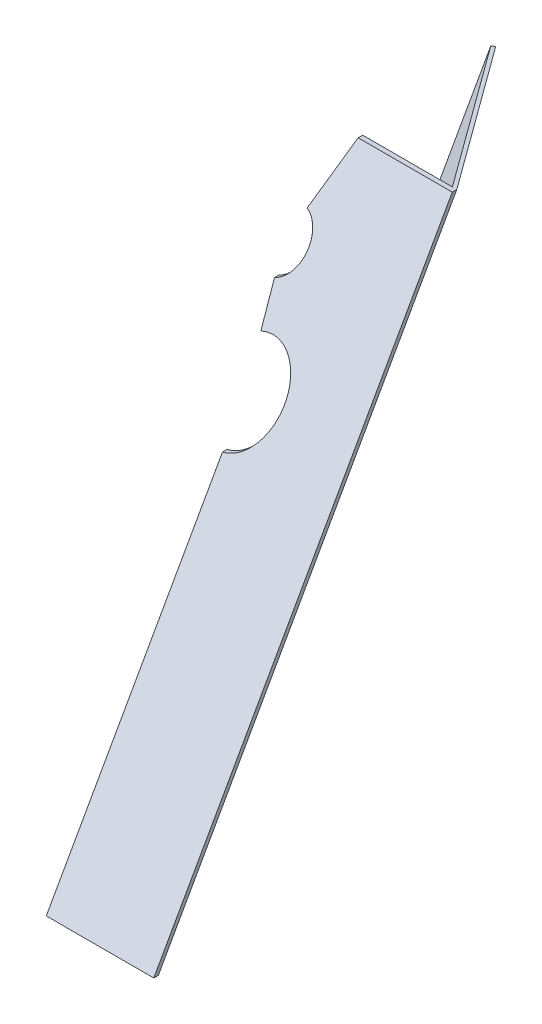
ISO-10303-21;
HEADER;
FILE_DESCRIPTION(('STEP AP214'),'2;1');
FILE_NAME('part.step','',(''),(''),'','','');
FILE_SCHEMA(('AUTOMOTIVE_DESIGN { 1 0 10303 214 1 1 1 1 }'));
ENDSEC;
DATA;
#1=APPLICATION_CONTEXT('core data for automotive mechanical design processes');
#2=APPLICATION_PROTOCOL_DEFINITION('international standard','automotive_design',2000,#1);
#3=PRODUCT_CONTEXT('',#1,'mechanical');
#4=PRODUCT('Part','Part','',(#3));
#5=PRODUCT_RELATED_PRODUCT_CATEGORY('part','',(#4));
#6=PRODUCT_DEFINITION_FORMATION('','',#4);
#7=PRODUCT_DEFINITION_CONTEXT('part definition',#1,'design');
#8=PRODUCT_DEFINITION('design','',#6,#7);
#9=PRODUCT_DEFINITION_SHAPE('','',#8);
#10=(LENGTH_UNIT() NAMED_UNIT(*) SI_UNIT(.MILLI.,.METRE.));
#11=(NAMED_UNIT(*) PLANE_ANGLE_UNIT() SI_UNIT($,.RADIAN.));
#12=(NAMED_UNIT(*) SI_UNIT($,.STERADIAN.) SOLID_ANGLE_UNIT());
#13=UNCERTAINTY_MEASURE_WITH_UNIT(LENGTH_MEASURE(1.E-05),#10,'distance_accuracy_value','');
#14=(GEOMETRIC_REPRESENTATION_CONTEXT(3) GLOBAL_UNCERTAINTY_ASSIGNED_CONTEXT((#13)) GLOBAL_UNIT_ASSIGNED_CONTEXT((#10,
#11,#12)) REPRESENTATION_CONTEXT('',''));
#15=CARTESIAN_POINT('',(0.,0.,0.));
#16=DIRECTION('',(0.,0.,1.));
#17=DIRECTION('',(1.,0.,0.));
#18=AXIS2_PLACEMENT_3D('',#15,#16,#17);
#19=CARTESIAN_POINT('',(0.,0.,0.));
#20=DIRECTION('',(0.,0.615661475325657,0.788010753606723));
#21=DIRECTION('',(0.,-0.788010753606723,0.615661475325657));
#22=AXIS2_PLACEMENT_3D('',#19,#20,#21);
#23=PLANE('',#22);
#24=DIRECTION('',(-0.209564715392473,-0.770512800762292,0.601990576275011));
#25=VECTOR('',#24,1.);
#26=CARTESIAN_POINT('',(-227.443511058113,38.4128157338381,-30.0113808064987));
#27=LINE('',#26,#25);
#28=CARTESIAN_POINT('',(-303.634542969345,-241.72100966204,188.853150473643));
#29=VERTEX_POINT('',#28);
#30=CARTESIAN_POINT('',(-312.982021819166,-276.089162216509,215.704494074039));
#31=VERTEX_POINT('',#30);
#32=EDGE_CURVE('E178',#29,#31,#27,.T.);
#33=ORIENTED_EDGE('',*,*,#32,.T.);
#34=CARTESIAN_POINT('',(-317.148366918662,-291.407686737882,227.672637101878));
#35=DIRECTION('',(0.,0.615661475325657,0.788010753606723));
#36=DIRECTION('',(0.,0.788010753606723,-0.615661475325657));
#37=AXIS2_PLACEMENT_3D('',#34,#35,#36);
#38=ELLIPSE('',#37,20.1456641642771,15.875);
#39=CARTESIAN_POINT('',(-312.26908061109,-306.514247899468,239.47517620337));
#40=VERTEX_POINT('',#39);
#41=EDGE_CURVE('E11',#31,#40,#38,.F.);
#42=ORIENTED_EDGE('',*,*,#41,.T.);
#43=DIRECTION('',(-0.246656603580926,0.763663542785337,-0.596639349465379));
#44=VECTOR('',#43,1.);
#45=CARTESIAN_POINT('',(-386.249002663396,-77.4680008124249,60.524635548958));
#46=LINE('',#45,#44);
#47=CARTESIAN_POINT('',(-305.438079780489,-327.663433525689,255.998730945459));
#48=VERTEX_POINT('',#47);
#49=EDGE_CURVE('E55',#48,#40,#46,.T.);
#50=ORIENTED_EDGE('',*,*,#49,.F.);
#51=CARTESIAN_POINT('',(-297.631221688374,-351.833931384226,274.882793507845));
#52=DIRECTION('',(0.,0.615661475325657,0.788010753606723));
#53=DIRECTION('',(0.,0.788010753606723,-0.615661475325657));
#54=AXIS2_PLACEMENT_3D('',#51,#52,#53);
#55=ELLIPSE('',#54,32.2330626628434,25.4);
#56=CARTESIAN_POINT('',(-294.096224923988,-376.986740330262,294.534321603653));
#57=VERTEX_POINT('',#56);
#58=EDGE_CURVE('E194',#48,#57,#55,.F.);
#59=ORIENTED_EDGE('',*,*,#58,.T.);
#60=DIRECTION('',(-0.110074710358999,0.783222261288649,-0.611920295104908));
#61=VECTOR('',#60,1.);
#62=CARTESIAN_POINT('',(-342.872902570837,-29.9226450433725,23.3781324794493));
#63=LINE('',#62,#61);
#64=CARTESIAN_POINT('',(-266.7,-571.92100966204,446.83366434616));
#65=VERTEX_POINT('',#64);
#66=EDGE_CURVE('E191',#65,#57,#63,.T.);
#67=ORIENTED_EDGE('',*,*,#66,.F.);
#68=DIRECTION('',(-1.,0.,0.));
#69=VECTOR('',#68,1.);
#70=CARTESIAN_POINT('',(0.,-571.92100966204,446.83366434616));
#71=LINE('',#70,#69);
#72=CARTESIAN_POINT('',(-190.5,-571.92100966204,446.83366434616));
#73=VERTEX_POINT('',#72);
#74=EDGE_CURVE('E188',#73,#65,#71,.T.);
#75=ORIENTED_EDGE('',*,*,#74,.F.);
#76=DIRECTION('',(0.110074710358999,-0.783222261288649,0.611920295104908));
#77=VECTOR('',#76,1.);
#78=CARTESIAN_POINT('',(-267.596175440616,-23.3532172202477,18.2455329468686));
#79=LINE('',#78,#77);
#80=CARTESIAN_POINT('',(-236.906583618729,-241.721009662041,188.853150473643));
#81=VERTEX_POINT('',#80);
#82=EDGE_CURVE('E185',#81,#73,#79,.T.);
#83=ORIENTED_EDGE('',*,*,#82,.F.);
#84=DIRECTION('',(1.,0.,0.));
#85=VECTOR('',#84,1.);
#86=CARTESIAN_POINT('',(-1.61917021465162E-13,-241.721009662041,188.853150473643));
#87=LINE('',#86,#85);
#88=EDGE_CURVE('E182',#29,#81,#87,.T.);
#89=ORIENTED_EDGE('',*,*,#88,.F.);
#90=EDGE_LOOP('',(#33,#42,#50,#59,#67,#75,#83,#89));
#91=FACE_BOUND('',#90,.T.);
#92=ADVANCED_FACE('F47',(#91),#23,.T.);
#93=CARTESIAN_POINT('',(-317.148366918662,-291.407686737882,781.890073663584));
#94=DIRECTION('',(0.,0.,-1.));
#95=DIRECTION('',(-1.,0.,0.));
#96=AXIS2_PLACEMENT_3D('',#93,#94,#95);
#97=CYLINDRICAL_SURFACE('',#96,15.875);
#98=DIRECTION('',(0.,0.,-1.));
#99=VECTOR('',#98,1.);
#100=CARTESIAN_POINT('',(-312.982021819166,-276.089162216509,781.890073663584));
#101=LINE('',#100,#99);
#102=CARTESIAN_POINT('',(-312.982021819166,-276.089162216508,212.481187807754));
#103=VERTEX_POINT('',#102);
#104=EDGE_CURVE('E217',#31,#103,#101,.T.);
#105=ORIENTED_EDGE('',*,*,#104,.T.);
#106=CARTESIAN_POINT('',(-317.148366918662,-291.407686737882,224.449330835594));
#107=DIRECTION('',(0.,0.615661475325657,0.788010753606723));
#108=DIRECTION('',(0.,0.788010753606723,-0.615661475325657));
#109=AXIS2_PLACEMENT_3D('',#106,#107,#108);
#110=ELLIPSE('',#109,20.1456641642771,15.875);
#111=CARTESIAN_POINT('',(-312.26908061109,-306.514247899468,236.251869937086));
#112=VERTEX_POINT('',#111);
#113=EDGE_CURVE('E175',#103,#112,#110,.F.);
#114=ORIENTED_EDGE('',*,*,#113,.T.);
#115=DIRECTION('',(0.,0.,-1.));
#116=VECTOR('',#115,1.);
#117=CARTESIAN_POINT('',(-312.26908061109,-306.514247899468,781.890073663584));
#118=LINE('',#117,#116);
#119=EDGE_CURVE('E160',#40,#112,#118,.T.);
#120=ORIENTED_EDGE('',*,*,#119,.F.);
#121=ORIENTED_EDGE('',*,*,#41,.F.);
#122=EDGE_LOOP('',(#105,#114,#120,#121));
#123=FACE_BOUND('',#122,.T.);
#124=ADVANCED_FACE('F210',(#123),#97,.F.);
#125=CARTESIAN_POINT('',(-372.418547742767,-120.28791339407,781.890073663584));
#126=DIRECTION('',(0.951594403879439,0.307356617799805,0.));
#127=DIRECTION('',(-0.307356617799805,0.951594403879439,0.));
#128=AXIS2_PLACEMENT_3D('',#125,#126,#127);
#129=PLANE('',#128);
#130=DIRECTION('',(-0.246656603580926,0.763663542785337,-0.596639349465379));
#131=VECTOR('',#130,1.);
#132=CARTESIAN_POINT('',(-385.774644682285,-78.9366413886135,58.4487570553544));
#133=LINE('',#132,#131);
#134=CARTESIAN_POINT('',(-305.438079780489,-327.663433525689,252.775424679174));
#135=VERTEX_POINT('',#134);
#136=EDGE_CURVE('E70',#135,#112,#133,.T.);
#137=ORIENTED_EDGE('',*,*,#136,.F.);
#138=DIRECTION('',(0.,0.,-1.));
#139=VECTOR('',#138,1.);
#140=CARTESIAN_POINT('',(-305.438079780489,-327.663433525689,781.890073663584));
#141=LINE('',#140,#139);
#142=EDGE_CURVE('E205',#48,#135,#141,.T.);
#143=ORIENTED_EDGE('',*,*,#142,.F.);
#144=ORIENTED_EDGE('',*,*,#49,.T.);
#145=ORIENTED_EDGE('',*,*,#119,.T.);
#146=EDGE_LOOP('',(#137,#143,#144,#145));
#147=FACE_BOUND('',#146,.T.);
#148=ADVANCED_FACE('F203',(#147),#129,.F.);
#149=CARTESIAN_POINT('',(-297.631221688374,-351.833931384226,781.890073663584));
#150=DIRECTION('',(0.,0.,-1.));
#151=DIRECTION('',(-1.,0.,0.));
#152=AXIS2_PLACEMENT_3D('',#149,#150,#151);
#153=CYLINDRICAL_SURFACE('',#152,25.4);
#154=ORIENTED_EDGE('',*,*,#142,.T.);
#155=CARTESIAN_POINT('',(-297.631221688374,-351.833931384226,271.659487241561));
#156=DIRECTION('',(0.,0.615661475325657,0.788010753606723));
#157=DIRECTION('',(0.,0.788010753606723,-0.615661475325657));
#158=AXIS2_PLACEMENT_3D('',#155,#156,#157);
#159=ELLIPSE('',#158,32.2330626628434,25.4);
#160=CARTESIAN_POINT('',(-294.096224923988,-376.986740330262,291.311015337369));
#161=VERTEX_POINT('',#160);
#162=EDGE_CURVE('E169',#135,#161,#159,.F.);
#163=ORIENTED_EDGE('',*,*,#162,.T.);
#164=DIRECTION('',(0.,0.,-1.));
#165=VECTOR('',#164,1.);
#166=CARTESIAN_POINT('',(-294.096224923988,-376.986740330262,781.890073663584));
#167=LINE('',#166,#165);
#168=EDGE_CURVE('E237',#57,#161,#167,.T.);
#169=ORIENTED_EDGE('',*,*,#168,.F.);
#170=ORIENTED_EDGE('',*,*,#58,.F.);
#171=EDGE_LOOP('',(#154,#163,#169,#170));
#172=FACE_BOUND('',#171,.T.);
#173=ADVANCED_FACE('F243',(#172),#153,.F.);
#174=CARTESIAN_POINT('',(-340.35564457309,-47.8338663839714,781.890073663584));
#175=DIRECTION('',(0.990268068741571,0.139173100960062,0.));
#176=DIRECTION('',(-0.139173100960062,0.990268068741571,0.));
#177=AXIS2_PLACEMENT_3D('',#174,#175,#176);
#178=PLANE('',#177);
#179=DIRECTION('',(-0.110074710358999,0.783222261288649,-0.611920295104908));
#180=VECTOR('',#179,1.);
#181=CARTESIAN_POINT('',(-342.655790494253,-31.4674777394618,21.3617817939772));
#182=LINE('',#181,#180);
#183=CARTESIAN_POINT('',(-266.7,-571.92100966204,443.610358079875));
#184=VERTEX_POINT('',#183);
#185=EDGE_CURVE('E166',#184,#161,#182,.T.);
#186=ORIENTED_EDGE('',*,*,#185,.F.);
#187=DIRECTION('',(0.,0.,-1.));
#188=VECTOR('',#187,1.);
#189=CARTESIAN_POINT('',(-266.7,-571.92100966204,781.890073663584));
#190=LINE('',#189,#188);
#191=EDGE_CURVE('E233',#65,#184,#190,.T.);
#192=ORIENTED_EDGE('',*,*,#191,.F.);
#193=ORIENTED_EDGE('',*,*,#66,.T.);
#194=ORIENTED_EDGE('',*,*,#168,.T.);
#195=EDGE_LOOP('',(#186,#192,#193,#194));
#196=FACE_BOUND('',#195,.T.);
#197=ADVANCED_FACE('F250',(#196),#178,.F.);
#198=CARTESIAN_POINT('',(0.,-571.92100966204,781.890073663584));
#199=DIRECTION('',(0.,1.,0.));
#200=DIRECTION('',(0.,0.,1.));
#201=AXIS2_PLACEMENT_3D('',#198,#199,#200);
#202=PLANE('',#201);
#203=DIRECTION('',(-1.,0.,0.));
#204=VECTOR('',#203,1.);
#205=CARTESIAN_POINT('',(0.,-571.92100966204,443.610358079875));
#206=LINE('',#205,#204);
#207=CARTESIAN_POINT('',(-193.642639476697,-571.92100966204,443.610358079875));
#208=VERTEX_POINT('',#207);
#209=EDGE_CURVE('E158',#208,#184,#206,.T.);
#210=ORIENTED_EDGE('',*,*,#209,.F.);
#211=DIRECTION('',(0.588856236540409,0.,0.808237794641816));
#212=VECTOR('',#211,1.);
#213=CARTESIAN_POINT('',(-266.575438200438,-571.92100966204,343.506052920688));
#214=LINE('',#213,#212);
#215=CARTESIAN_POINT('',(-266.575438200438,-571.92100966204,343.506052920688));
#216=VERTEX_POINT('',#215);
#217=EDGE_CURVE('E62',#216,#208,#214,.T.);
#218=ORIENTED_EDGE('',*,*,#217,.F.);
#219=DIRECTION('',(-0.808237794641821,0.,0.588856236540402));
#220=VECTOR('',#219,1.);
#221=CARTESIAN_POINT('',(-264.522514202048,-571.92100966204,342.010358079875));
#222=LINE('',#221,#220);
#223=CARTESIAN_POINT('',(-264.522514202048,-571.92100966204,342.010358079875));
#224=VERTEX_POINT('',#223);
#225=EDGE_CURVE('E268',#224,#216,#222,.T.);
#226=ORIENTED_EDGE('',*,*,#225,.F.);
#227=DIRECTION('',(-0.588856236540408,0.,-0.808237794641816));
#228=VECTOR('',#227,1.);
#229=CARTESIAN_POINT('',(-190.5,-571.92100966204,443.610358079875));
#230=LINE('',#229,#228);
#231=CARTESIAN_POINT('',(-190.5,-571.92100966204,443.610358079875));
#232=VERTEX_POINT('',#231);
#233=EDGE_CURVE('E147',#232,#224,#230,.T.);
#234=ORIENTED_EDGE('',*,*,#233,.F.);
#235=DIRECTION('',(0.,0.,-1.));
#236=VECTOR('',#235,1.);
#237=CARTESIAN_POINT('',(-190.5,-571.92100966204,781.890073663584));
#238=LINE('',#237,#236);
#239=EDGE_CURVE('E225',#73,#232,#238,.T.);
#240=ORIENTED_EDGE('',*,*,#239,.F.);
#241=ORIENTED_EDGE('',*,*,#74,.T.);
#242=ORIENTED_EDGE('',*,*,#191,.T.);
#243=EDGE_LOOP('',(#210,#218,#226,#234,#240,#241,#242));
#244=FACE_BOUND('',#243,.T.);
#245=ADVANCED_FACE('F252',(#244),#202,.F.);
#246=CARTESIAN_POINT('',(-265.63157395784,-37.332083127344,781.890073663584));
#247=DIRECTION('',(-0.990268068741571,-0.139173100960062,0.));
#248=DIRECTION('',(0.139173100960062,-0.990268068741571,0.));
#249=AXIS2_PLACEMENT_3D('',#246,#247,#248);
#250=PLANE('',#249);
#251=DIRECTION('',(0.110074710358999,-0.783222261288649,0.611920295104908));
#252=VECTOR('',#251,1.);
#253=CARTESIAN_POINT('',(-267.379063364032,-24.898049916337,16.2291822613965));
#254=LINE('',#253,#252);
#255=CARTESIAN_POINT('',(-236.906583618729,-241.72100966204,185.629844207358));
#256=VERTEX_POINT('',#255);
#257=EDGE_CURVE('E153',#256,#232,#254,.T.);
#258=ORIENTED_EDGE('',*,*,#257,.F.);
#259=DIRECTION('',(0.,0.,-1.));
#260=VECTOR('',#259,1.);
#261=CARTESIAN_POINT('',(-236.906583618729,-241.721009662041,781.890073663584));
#262=LINE('',#261,#260);
#263=EDGE_CURVE('E221',#81,#256,#262,.T.);
#264=ORIENTED_EDGE('',*,*,#263,.F.);
#265=ORIENTED_EDGE('',*,*,#82,.T.);
#266=ORIENTED_EDGE('',*,*,#239,.T.);
#267=EDGE_LOOP('',(#258,#264,#265,#266));
#268=FACE_BOUND('',#267,.T.);
#269=ADVANCED_FACE('F257',(#268),#250,.F.);
#270=CARTESIAN_POINT('',(-1.00544147113933E-13,-241.721009662041,781.890073663584));
#271=DIRECTION('',(0.,-1.,0.));
#272=DIRECTION('',(1.,0.,0.));
#273=AXIS2_PLACEMENT_3D('',#270,#271,#272);
#274=PLANE('',#273);
#275=DIRECTION('',(1.,0.,0.));
#276=VECTOR('',#275,1.);
#277=CARTESIAN_POINT('',(-1.6086952201927E-13,-241.721009662041,185.629844207359));
#278=LINE('',#277,#276);
#279=CARTESIAN_POINT('',(-303.634542969345,-241.72100966204,185.629844207358));
#280=VERTEX_POINT('',#279);
#281=CARTESIAN_POINT('',(-240.049223095426,-241.72100966204,185.629844207358));
#282=VERTEX_POINT('',#281);
#283=EDGE_CURVE('E136',#280,#282,#278,.T.);
#284=ORIENTED_EDGE('',*,*,#283,.F.);
#285=DIRECTION('',(0.,0.,-1.));
#286=VECTOR('',#285,1.);
#287=CARTESIAN_POINT('',(-303.634542969345,-241.72100966204,781.890073663584));
#288=LINE('',#287,#286);
#289=EDGE_CURVE('E216',#29,#280,#288,.T.);
#290=ORIENTED_EDGE('',*,*,#289,.F.);
#291=ORIENTED_EDGE('',*,*,#88,.T.);
#292=ORIENTED_EDGE('',*,*,#263,.T.);
#293=DIRECTION('',(-0.588856236540408,0.,-0.808237794641816));
#294=VECTOR('',#293,1.);
#295=CARTESIAN_POINT('',(-236.906583618729,-241.72100966204,185.629844207358));
#296=LINE('',#295,#294);
#297=CARTESIAN_POINT('',(-310.929097820776,-241.72100966204,84.0298442073585));
#298=VERTEX_POINT('',#297);
#299=EDGE_CURVE('E258',#256,#298,#296,.T.);
#300=ORIENTED_EDGE('',*,*,#299,.T.);
#301=DIRECTION('',(-0.808237794641821,0.,0.588856236540402));
#302=VECTOR('',#301,1.);
#303=CARTESIAN_POINT('',(-310.929097820776,-241.72100966204,84.0298442073585));
#304=LINE('',#303,#302);
#305=CARTESIAN_POINT('',(-312.982021819166,-241.72100966204,85.5255390481711));
#306=VERTEX_POINT('',#305);
#307=EDGE_CURVE('E139',#298,#306,#304,.T.);
#308=ORIENTED_EDGE('',*,*,#307,.T.);
#309=DIRECTION('',(0.588856236540409,0.,0.808237794641816));
#310=VECTOR('',#309,1.);
#311=CARTESIAN_POINT('',(-312.982021819166,-241.72100966204,85.5255390481711));
#312=LINE('',#311,#310);
#313=EDGE_CURVE('E132',#306,#282,#312,.T.);
#314=ORIENTED_EDGE('',*,*,#313,.T.);
#315=EDGE_LOOP('',(#284,#290,#291,#292,#300,#308,#314));
#316=FACE_BOUND('',#315,.T.);
#317=ADVANCED_FACE('F133',(#316),#274,.F.);
#318=CARTESIAN_POINT('',(-221.505506589186,60.2452527723146,781.890073663584));
#319=DIRECTION('',(-0.964946426543196,0.262446935401265,0.));
#320=DIRECTION('',(-0.262446935401265,-0.964946426543196,0.));
#321=AXIS2_PLACEMENT_3D('',#318,#319,#320);
#322=PLANE('',#321);
#323=ORIENTED_EDGE('',*,*,#289,.T.);
#324=DIRECTION('',(-0.209564715392473,-0.770512800762292,0.601990576275011));
#325=VECTOR('',#324,1.);
#326=CARTESIAN_POINT('',(-227.85015043118,36.9177126977421,-32.0665845605347));
#327=LINE('',#326,#325);
#328=EDGE_CURVE('E151',#280,#103,#327,.T.);
#329=ORIENTED_EDGE('',*,*,#328,.T.);
#330=ORIENTED_EDGE('',*,*,#104,.F.);
#331=ORIENTED_EDGE('',*,*,#32,.F.);
#332=EDGE_LOOP('',(#323,#329,#330,#331));
#333=FACE_BOUND('',#332,.T.);
#334=ADVANCED_FACE('F215',(#333),#322,.T.);
#335=CARTESIAN_POINT('',(0.,-1.56378014732717,-2.00154731416108));
#336=DIRECTION('',(0.,0.615661475325657,0.788010753606723));
#337=DIRECTION('',(0.,-0.788010753606723,0.615661475325657));
#338=AXIS2_PLACEMENT_3D('',#335,#336,#337);
#339=PLANE('',#338);
#340=ORIENTED_EDGE('',*,*,#283,.T.);
#341=DIRECTION('',(0.110074710358999,-0.783222261288649,0.611920295104908));
#342=VECTOR('',#341,1.);
#343=CARTESIAN_POINT('',(-240.049223095426,-241.72100966204,185.629844207358));
#344=LINE('',#343,#342);
#345=EDGE_CURVE('E142',#282,#208,#344,.T.);
#346=ORIENTED_EDGE('',*,*,#345,.T.);
#347=ORIENTED_EDGE('',*,*,#209,.T.);
#348=ORIENTED_EDGE('',*,*,#185,.T.);
#349=ORIENTED_EDGE('',*,*,#162,.F.);
#350=ORIENTED_EDGE('',*,*,#136,.T.);
#351=ORIENTED_EDGE('',*,*,#113,.F.);
#352=ORIENTED_EDGE('',*,*,#328,.F.);
#353=EDGE_LOOP('',(#340,#346,#347,#348,#349,#350,#351,#352));
#354=FACE_BOUND('',#353,.T.);
#355=ADVANCED_FACE('F149',(#354),#339,.F.);
#356=CARTESIAN_POINT('',(-236.906583618729,-241.72100966204,185.629844207358));
#357=DIRECTION('',(-0.763697731931071,0.327381113715465,0.556405769763182));
#358=DIRECTION('',(0.588856236540409,0.,0.808237794641816));
#359=AXIS2_PLACEMENT_3D('',#356,#357,#358);
#360=PLANE('',#359);
#361=DIRECTION('',(0.110074710358999,-0.783222261288649,0.611920295104908));
#362=VECTOR('',#361,1.);
#363=CARTESIAN_POINT('',(-310.929097820776,-241.72100966204,84.0298442073585));
#364=LINE('',#363,#362);
#365=EDGE_CURVE('E264',#298,#224,#364,.T.);
#366=ORIENTED_EDGE('',*,*,#365,.F.);
#367=ORIENTED_EDGE('',*,*,#299,.F.);
#368=ORIENTED_EDGE('',*,*,#257,.T.);
#369=ORIENTED_EDGE('',*,*,#233,.T.);
#370=EDGE_LOOP('',(#366,#367,#368,#369));
#371=FACE_BOUND('',#370,.T.);
#372=ADVANCED_FACE('F265',(#371),#360,.F.);
#373=CARTESIAN_POINT('',(-310.929097820776,-241.72100966204,84.0298442073585));
#374=DIRECTION('',(0.479186261101339,0.581204356503753,0.657709679990174));
#375=DIRECTION('',(0.,-0.749344605888507,0.662180233490701));
#376=AXIS2_PLACEMENT_3D('',#373,#374,#375);
#377=PLANE('',#376);
#378=DIRECTION('',(0.110074710358999,-0.783222261288649,0.611920295104908));
#379=VECTOR('',#378,1.);
#380=CARTESIAN_POINT('',(-312.982021819166,-241.72100966204,85.5255390481711));
#381=LINE('',#380,#379);
#382=EDGE_CURVE('E272',#306,#216,#381,.T.);
#383=ORIENTED_EDGE('',*,*,#382,.F.);
#384=ORIENTED_EDGE('',*,*,#307,.F.);
#385=ORIENTED_EDGE('',*,*,#365,.T.);
#386=ORIENTED_EDGE('',*,*,#225,.T.);
#387=EDGE_LOOP('',(#383,#384,#385,#386));
#388=FACE_BOUND('',#387,.T.);
#389=ADVANCED_FACE('F280',(#388),#377,.F.);
#390=CARTESIAN_POINT('',(-312.982021819166,-241.72100966204,85.5255390481711));
#391=DIRECTION('',(0.763697731931071,-0.327381113715465,-0.556405769763183));
#392=DIRECTION('',(-0.588856236540409,0.,-0.808237794641816));
#393=AXIS2_PLACEMENT_3D('',#390,#391,#392);
#394=PLANE('',#393);
#395=ORIENTED_EDGE('',*,*,#217,.T.);
#396=ORIENTED_EDGE('',*,*,#345,.F.);
#397=ORIENTED_EDGE('',*,*,#313,.F.);
#398=ORIENTED_EDGE('',*,*,#382,.T.);
#399=EDGE_LOOP('',(#395,#396,#397,#398));
#400=FACE_BOUND('',#399,.T.);
#401=ADVANCED_FACE('F144',(#400),#394,.F.);
#402=CLOSED_SHELL('',(#92,#124,#148,#173,#197,#245,#269,#317,#334,#355,#372,#389,#401));
#403=MANIFOLD_SOLID_BREP('B2',#402);
#404=ADVANCED_BREP_SHAPE_REPRESENTATION('',(#18,#403),#14);
#405=SHAPE_DEFINITION_REPRESENTATION(#9,#404);
ENDSEC;
END-ISO-10303-21;
